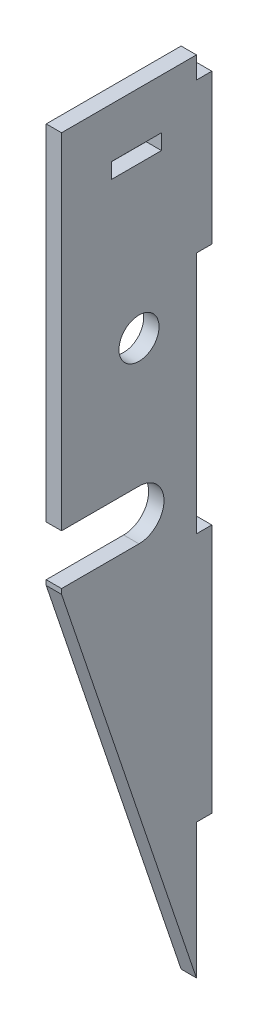
ISO-10303-21;
HEADER;
FILE_DESCRIPTION(('STEP AP214'),'2;1');
FILE_NAME('part.step','',(''),(''),'','','');
FILE_SCHEMA(('AUTOMOTIVE_DESIGN { 1 0 10303 214 1 1 1 1 }'));
ENDSEC;
DATA;
#1=APPLICATION_CONTEXT('core data for automotive mechanical design processes');
#2=APPLICATION_PROTOCOL_DEFINITION('international standard','automotive_design',2000,#1);
#3=PRODUCT_CONTEXT('',#1,'mechanical');
#4=PRODUCT('Part','Part','',(#3));
#5=PRODUCT_RELATED_PRODUCT_CATEGORY('part','',(#4));
#6=PRODUCT_DEFINITION_FORMATION('','',#4);
#7=PRODUCT_DEFINITION_CONTEXT('part definition',#1,'design');
#8=PRODUCT_DEFINITION('design','',#6,#7);
#9=PRODUCT_DEFINITION_SHAPE('','',#8);
#10=(LENGTH_UNIT() NAMED_UNIT(*) SI_UNIT(.MILLI.,.METRE.));
#11=(NAMED_UNIT(*) PLANE_ANGLE_UNIT() SI_UNIT($,.RADIAN.));
#12=(NAMED_UNIT(*) SI_UNIT($,.STERADIAN.) SOLID_ANGLE_UNIT());
#13=UNCERTAINTY_MEASURE_WITH_UNIT(LENGTH_MEASURE(1.E-05),#10,'distance_accuracy_value','');
#14=(GEOMETRIC_REPRESENTATION_CONTEXT(3) GLOBAL_UNCERTAINTY_ASSIGNED_CONTEXT((#13)) GLOBAL_UNIT_ASSIGNED_CONTEXT((#10,
#11,#12)) REPRESENTATION_CONTEXT('',''));
#15=CARTESIAN_POINT('',(0.,0.,0.));
#16=DIRECTION('',(0.,0.,1.));
#17=DIRECTION('',(1.,0.,0.));
#18=AXIS2_PLACEMENT_3D('',#15,#16,#17);
#19=CARTESIAN_POINT('',(-32.09,71.6557513110646,-4.07));
#20=DIRECTION('',(0.,0.,1.));
#21=DIRECTION('',(1.,0.,0.));
#22=AXIS2_PLACEMENT_3D('',#19,#20,#21);
#23=PLANE('',#22);
#24=DIRECTION('',(0.,-1.,0.));
#25=VECTOR('',#24,1.);
#26=CARTESIAN_POINT('',(-29.02,71.6557513110646,-4.07));
#27=LINE('',#26,#25);
#28=CARTESIAN_POINT('',(-29.02,101.635751311065,-4.07));
#29=VERTEX_POINT('',#28);
#30=CARTESIAN_POINT('',(-29.02,71.6557513110646,-4.07));
#31=VERTEX_POINT('',#30);
#32=EDGE_CURVE('E205',#29,#31,#27,.T.);
#33=ORIENTED_EDGE('',*,*,#32,.T.);
#34=DIRECTION('',(1.,0.,0.));
#35=VECTOR('',#34,1.);
#36=CARTESIAN_POINT('',(-32.09,71.6557513110646,-4.07));
#37=LINE('',#36,#35);
#38=CARTESIAN_POINT('',(-32.09,71.6557513110646,-4.07));
#39=VERTEX_POINT('',#38);
#40=EDGE_CURVE('E316',#39,#31,#37,.T.);
#41=ORIENTED_EDGE('',*,*,#40,.F.);
#42=DIRECTION('',(0.,-1.,0.));
#43=VECTOR('',#42,1.);
#44=CARTESIAN_POINT('',(-32.09,71.6557513110646,-4.07));
#45=LINE('',#44,#43);
#46=CARTESIAN_POINT('',(-32.09,101.635751311065,-4.07));
#47=VERTEX_POINT('',#46);
#48=EDGE_CURVE('E206',#47,#39,#45,.T.);
#49=ORIENTED_EDGE('',*,*,#48,.F.);
#50=DIRECTION('',(1.,0.,0.));
#51=VECTOR('',#50,1.);
#52=CARTESIAN_POINT('',(-32.09,101.635751311065,-4.07));
#53=LINE('',#52,#51);
#54=EDGE_CURVE('E240',#47,#29,#53,.T.);
#55=ORIENTED_EDGE('',*,*,#54,.T.);
#56=EDGE_LOOP('',(#33,#41,#49,#55));
#57=FACE_BOUND('',#56,.T.);
#58=ADVANCED_FACE('F43',(#57),#23,.F.);
#59=CARTESIAN_POINT('',(-32.09,71.6557513110646,-1.));
#60=DIRECTION('',(0.,1.,0.));
#61=DIRECTION('',(-1.,0.,0.));
#62=AXIS2_PLACEMENT_3D('',#59,#60,#61);
#63=PLANE('',#62);
#64=DIRECTION('',(0.,0.,1.));
#65=VECTOR('',#64,1.);
#66=CARTESIAN_POINT('',(-29.02,71.6557513110646,-1.));
#67=LINE('',#66,#65);
#68=CARTESIAN_POINT('',(-29.02,71.6557513110646,-1.));
#69=VERTEX_POINT('',#68);
#70=EDGE_CURVE('E243',#31,#69,#67,.T.);
#71=ORIENTED_EDGE('',*,*,#70,.T.);
#72=DIRECTION('',(1.,0.,0.));
#73=VECTOR('',#72,1.);
#74=CARTESIAN_POINT('',(-32.09,71.6557513110646,-1.));
#75=LINE('',#74,#73);
#76=CARTESIAN_POINT('',(-32.09,71.6557513110646,-1.));
#77=VERTEX_POINT('',#76);
#78=EDGE_CURVE('E313',#77,#69,#75,.T.);
#79=ORIENTED_EDGE('',*,*,#78,.F.);
#80=DIRECTION('',(0.,0.,1.));
#81=VECTOR('',#80,1.);
#82=CARTESIAN_POINT('',(-32.09,71.6557513110646,-1.));
#83=LINE('',#82,#81);
#84=EDGE_CURVE('E209',#39,#77,#83,.T.);
#85=ORIENTED_EDGE('',*,*,#84,.F.);
#86=ORIENTED_EDGE('',*,*,#40,.T.);
#87=EDGE_LOOP('',(#71,#79,#85,#86));
#88=FACE_BOUND('',#87,.T.);
#89=ADVANCED_FACE('F347',(#88),#63,.F.);
#90=CARTESIAN_POINT('',(-32.09,22.99,-1.));
#91=DIRECTION('',(0.,0.,1.));
#92=DIRECTION('',(1.,0.,0.));
#93=AXIS2_PLACEMENT_3D('',#90,#91,#92);
#94=PLANE('',#93);
#95=DIRECTION('',(0.,-1.,0.));
#96=VECTOR('',#95,1.);
#97=CARTESIAN_POINT('',(-29.02,22.99,-1.));
#98=LINE('',#97,#96);
#99=CARTESIAN_POINT('',(-29.02,22.99,-1.));
#100=VERTEX_POINT('',#99);
#101=EDGE_CURVE('E245',#69,#100,#98,.T.);
#102=ORIENTED_EDGE('',*,*,#101,.T.);
#103=DIRECTION('',(1.,0.,0.));
#104=VECTOR('',#103,1.);
#105=CARTESIAN_POINT('',(-32.09,22.99,-1.));
#106=LINE('',#105,#104);
#107=CARTESIAN_POINT('',(-32.09,22.99,-1.));
#108=VERTEX_POINT('',#107);
#109=EDGE_CURVE('E310',#108,#100,#106,.T.);
#110=ORIENTED_EDGE('',*,*,#109,.F.);
#111=DIRECTION('',(0.,-1.,0.));
#112=VECTOR('',#111,1.);
#113=CARTESIAN_POINT('',(-32.09,22.99,-1.));
#114=LINE('',#113,#112);
#115=EDGE_CURVE('E212',#77,#108,#114,.T.);
#116=ORIENTED_EDGE('',*,*,#115,.F.);
#117=ORIENTED_EDGE('',*,*,#78,.T.);
#118=EDGE_LOOP('',(#102,#110,#116,#117));
#119=FACE_BOUND('',#118,.T.);
#120=ADVANCED_FACE('F353',(#119),#94,.F.);
#121=CARTESIAN_POINT('',(-32.09,22.99,-4.07));
#122=DIRECTION('',(0.,-1.,0.));
#123=DIRECTION('',(0.,0.,-1.));
#124=AXIS2_PLACEMENT_3D('',#121,#122,#123);
#125=PLANE('',#124);
#126=DIRECTION('',(0.,0.,-1.));
#127=VECTOR('',#126,1.);
#128=CARTESIAN_POINT('',(-29.02,22.99,-4.07));
#129=LINE('',#128,#127);
#130=CARTESIAN_POINT('',(-29.02,22.99,-4.07));
#131=VERTEX_POINT('',#130);
#132=EDGE_CURVE('E247',#100,#131,#129,.T.);
#133=ORIENTED_EDGE('',*,*,#132,.T.);
#134=DIRECTION('',(1.,0.,0.));
#135=VECTOR('',#134,1.);
#136=CARTESIAN_POINT('',(-32.09,22.99,-4.07));
#137=LINE('',#136,#135);
#138=CARTESIAN_POINT('',(-32.09,22.99,-4.07));
#139=VERTEX_POINT('',#138);
#140=EDGE_CURVE('E307',#139,#131,#137,.T.);
#141=ORIENTED_EDGE('',*,*,#140,.F.);
#142=DIRECTION('',(0.,0.,-1.));
#143=VECTOR('',#142,1.);
#144=CARTESIAN_POINT('',(-32.09,22.99,-4.07));
#145=LINE('',#144,#143);
#146=EDGE_CURVE('E214',#108,#139,#145,.T.);
#147=ORIENTED_EDGE('',*,*,#146,.F.);
#148=ORIENTED_EDGE('',*,*,#109,.T.);
#149=EDGE_LOOP('',(#133,#141,#147,#148));
#150=FACE_BOUND('',#149,.T.);
#151=ADVANCED_FACE('F427',(#150),#125,.F.);
#152=CARTESIAN_POINT('',(-32.09,-26.99,-4.07));
#153=DIRECTION('',(0.,0.,1.));
#154=DIRECTION('',(1.,0.,0.));
#155=AXIS2_PLACEMENT_3D('',#152,#153,#154);
#156=PLANE('',#155);
#157=DIRECTION('',(0.,-1.,0.));
#158=VECTOR('',#157,1.);
#159=CARTESIAN_POINT('',(-29.02,-26.99,-4.07));
#160=LINE('',#159,#158);
#161=CARTESIAN_POINT('',(-29.02,-26.99,-4.07));
#162=VERTEX_POINT('',#161);
#163=EDGE_CURVE('E249',#131,#162,#160,.T.);
#164=ORIENTED_EDGE('',*,*,#163,.T.);
#165=DIRECTION('',(1.,0.,0.));
#166=VECTOR('',#165,1.);
#167=CARTESIAN_POINT('',(-32.09,-26.99,-4.07));
#168=LINE('',#167,#166);
#169=CARTESIAN_POINT('',(-32.09,-26.99,-4.07));
#170=VERTEX_POINT('',#169);
#171=EDGE_CURVE('E304',#170,#162,#168,.T.);
#172=ORIENTED_EDGE('',*,*,#171,.F.);
#173=DIRECTION('',(0.,-1.,0.));
#174=VECTOR('',#173,1.);
#175=CARTESIAN_POINT('',(-32.09,-26.99,-4.07));
#176=LINE('',#175,#174);
#177=EDGE_CURVE('E216',#139,#170,#176,.T.);
#178=ORIENTED_EDGE('',*,*,#177,.F.);
#179=ORIENTED_EDGE('',*,*,#140,.T.);
#180=EDGE_LOOP('',(#164,#172,#178,#179));
#181=FACE_BOUND('',#180,.T.);
#182=ADVANCED_FACE('F422',(#181),#156,.F.);
#183=CARTESIAN_POINT('',(-32.09,-26.99,-1.));
#184=DIRECTION('',(0.,1.,0.));
#185=DIRECTION('',(-1.,0.,0.));
#186=AXIS2_PLACEMENT_3D('',#183,#184,#185);
#187=PLANE('',#186);
#188=DIRECTION('',(0.,0.,1.));
#189=VECTOR('',#188,1.);
#190=CARTESIAN_POINT('',(-29.02,-26.99,-1.));
#191=LINE('',#190,#189);
#192=CARTESIAN_POINT('',(-29.02,-26.99,-1.));
#193=VERTEX_POINT('',#192);
#194=EDGE_CURVE('E251',#162,#193,#191,.T.);
#195=ORIENTED_EDGE('',*,*,#194,.T.);
#196=DIRECTION('',(1.,0.,0.));
#197=VECTOR('',#196,1.);
#198=CARTESIAN_POINT('',(-32.09,-26.99,-1.));
#199=LINE('',#198,#197);
#200=CARTESIAN_POINT('',(-32.09,-26.99,-1.));
#201=VERTEX_POINT('',#200);
#202=EDGE_CURVE('E301',#201,#193,#199,.T.);
#203=ORIENTED_EDGE('',*,*,#202,.F.);
#204=DIRECTION('',(0.,0.,1.));
#205=VECTOR('',#204,1.);
#206=CARTESIAN_POINT('',(-32.09,-26.99,-1.));
#207=LINE('',#206,#205);
#208=EDGE_CURVE('E218',#170,#201,#207,.T.);
#209=ORIENTED_EDGE('',*,*,#208,.F.);
#210=ORIENTED_EDGE('',*,*,#171,.T.);
#211=EDGE_LOOP('',(#195,#203,#209,#210));
#212=FACE_BOUND('',#211,.T.);
#213=ADVANCED_FACE('F418',(#212),#187,.F.);
#214=CARTESIAN_POINT('',(-32.09,-54.,-1.));
#215=DIRECTION('',(0.,0.,1.));
#216=DIRECTION('',(1.,0.,0.));
#217=AXIS2_PLACEMENT_3D('',#214,#215,#216);
#218=PLANE('',#217);
#219=DIRECTION('',(0.,-1.,0.));
#220=VECTOR('',#219,1.);
#221=CARTESIAN_POINT('',(-29.02,-54.,-1.));
#222=LINE('',#221,#220);
#223=CARTESIAN_POINT('',(-29.02,-54.,-1.));
#224=VERTEX_POINT('',#223);
#225=EDGE_CURVE('E253',#193,#224,#222,.T.);
#226=ORIENTED_EDGE('',*,*,#225,.T.);
#227=DIRECTION('',(1.,0.,0.));
#228=VECTOR('',#227,1.);
#229=CARTESIAN_POINT('',(-32.09,-54.,-1.));
#230=LINE('',#229,#228);
#231=CARTESIAN_POINT('',(-32.09,-54.,-1.));
#232=VERTEX_POINT('',#231);
#233=EDGE_CURVE('E298',#232,#224,#230,.T.);
#234=ORIENTED_EDGE('',*,*,#233,.F.);
#235=DIRECTION('',(0.,-1.,0.));
#236=VECTOR('',#235,1.);
#237=CARTESIAN_POINT('',(-32.09,-54.,-1.));
#238=LINE('',#237,#236);
#239=EDGE_CURVE('E220',#201,#232,#238,.T.);
#240=ORIENTED_EDGE('',*,*,#239,.F.);
#241=ORIENTED_EDGE('',*,*,#202,.T.);
#242=EDGE_LOOP('',(#226,#234,#240,#241));
#243=FACE_BOUND('',#242,.T.);
#244=ADVANCED_FACE('F414',(#243),#218,.F.);
#245=CARTESIAN_POINT('',(-32.09,26.,26.));
#246=DIRECTION('',(0.,0.31977864415818,-0.947492278987199));
#247=DIRECTION('',(0.,0.947492278987199,0.31977864415818));
#248=AXIS2_PLACEMENT_3D('',#245,#246,#247);
#249=PLANE('',#248);
#250=DIRECTION('',(0.,0.947492278987199,0.31977864415818));
#251=VECTOR('',#250,1.);
#252=CARTESIAN_POINT('',(-29.02,26.,26.));
#253=LINE('',#252,#251);
#254=CARTESIAN_POINT('',(-29.02,26.,26.));
#255=VERTEX_POINT('',#254);
#256=EDGE_CURVE('E255',#224,#255,#253,.T.);
#257=ORIENTED_EDGE('',*,*,#256,.T.);
#258=DIRECTION('',(1.,0.,0.));
#259=VECTOR('',#258,1.);
#260=CARTESIAN_POINT('',(-32.09,26.,26.));
#261=LINE('',#260,#259);
#262=CARTESIAN_POINT('',(-32.09,26.,26.));
#263=VERTEX_POINT('',#262);
#264=EDGE_CURVE('E295',#263,#255,#261,.T.);
#265=ORIENTED_EDGE('',*,*,#264,.F.);
#266=DIRECTION('',(0.,0.947492278987199,0.31977864415818));
#267=VECTOR('',#266,1.);
#268=CARTESIAN_POINT('',(-32.09,26.,26.));
#269=LINE('',#268,#267);
#270=EDGE_CURVE('E222',#232,#263,#269,.T.);
#271=ORIENTED_EDGE('',*,*,#270,.F.);
#272=ORIENTED_EDGE('',*,*,#233,.T.);
#273=EDGE_LOOP('',(#257,#265,#271,#272));
#274=FACE_BOUND('',#273,.T.);
#275=ADVANCED_FACE('F409',(#274),#249,.F.);
#276=CARTESIAN_POINT('',(-32.09,27.,26.));
#277=DIRECTION('',(0.,0.,-1.));
#278=DIRECTION('',(-1.,0.,0.));
#279=AXIS2_PLACEMENT_3D('',#276,#277,#278);
#280=PLANE('',#279);
#281=DIRECTION('',(0.,1.,0.));
#282=VECTOR('',#281,1.);
#283=CARTESIAN_POINT('',(-29.02,27.,26.));
#284=LINE('',#283,#282);
#285=CARTESIAN_POINT('',(-29.02,27.,26.));
#286=VERTEX_POINT('',#285);
#287=EDGE_CURVE('E257',#255,#286,#284,.T.);
#288=ORIENTED_EDGE('',*,*,#287,.T.);
#289=DIRECTION('',(1.,0.,0.));
#290=VECTOR('',#289,1.);
#291=CARTESIAN_POINT('',(-32.09,27.,26.));
#292=LINE('',#291,#290);
#293=CARTESIAN_POINT('',(-32.09,27.,26.));
#294=VERTEX_POINT('',#293);
#295=EDGE_CURVE('E292',#294,#286,#292,.T.);
#296=ORIENTED_EDGE('',*,*,#295,.F.);
#297=DIRECTION('',(0.,1.,0.));
#298=VECTOR('',#297,1.);
#299=CARTESIAN_POINT('',(-32.09,27.,26.));
#300=LINE('',#299,#298);
#301=EDGE_CURVE('E224',#263,#294,#300,.T.);
#302=ORIENTED_EDGE('',*,*,#301,.F.);
#303=ORIENTED_EDGE('',*,*,#264,.T.);
#304=EDGE_LOOP('',(#288,#296,#302,#303));
#305=FACE_BOUND('',#304,.T.);
#306=ADVANCED_FACE('F403',(#305),#280,.F.);
#307=CARTESIAN_POINT('',(-32.09,27.,26.));
#308=DIRECTION('',(0.,-1.,0.));
#309=DIRECTION('',(1.,0.,0.));
#310=AXIS2_PLACEMENT_3D('',#307,#308,#309);
#311=PLANE('',#310);
#312=DIRECTION('',(0.,0.,-1.));
#313=VECTOR('',#312,1.);
#314=CARTESIAN_POINT('',(-29.02,27.,26.));
#315=LINE('',#314,#313);
#316=CARTESIAN_POINT('',(-29.02,27.,10.5));
#317=VERTEX_POINT('',#316);
#318=EDGE_CURVE('E259',#286,#317,#315,.T.);
#319=ORIENTED_EDGE('',*,*,#318,.T.);
#320=DIRECTION('',(1.,0.,0.));
#321=VECTOR('',#320,1.);
#322=CARTESIAN_POINT('',(-32.09,27.,10.5));
#323=LINE('',#322,#321);
#324=CARTESIAN_POINT('',(-32.09,27.,10.5));
#325=VERTEX_POINT('',#324);
#326=EDGE_CURVE('E289',#325,#317,#323,.T.);
#327=ORIENTED_EDGE('',*,*,#326,.F.);
#328=DIRECTION('',(0.,0.,-1.));
#329=VECTOR('',#328,1.);
#330=CARTESIAN_POINT('',(-32.09,27.,26.));
#331=LINE('',#330,#329);
#332=EDGE_CURVE('E226',#294,#325,#331,.T.);
#333=ORIENTED_EDGE('',*,*,#332,.F.);
#334=ORIENTED_EDGE('',*,*,#295,.T.);
#335=EDGE_LOOP('',(#319,#327,#333,#334));
#336=FACE_BOUND('',#335,.T.);
#337=ADVANCED_FACE('F399',(#336),#311,.F.);
#338=CARTESIAN_POINT('',(-32.09,32.,10.5));
#339=DIRECTION('',(1.,0.,0.));
#340=DIRECTION('',(0.,1.,0.));
#341=AXIS2_PLACEMENT_3D('',#338,#339,#340);
#342=CYLINDRICAL_SURFACE('',#341,5.00000000000001);
#343=CARTESIAN_POINT('',(-29.02,32.,10.5));
#344=DIRECTION('',(1.,0.,0.));
#345=DIRECTION('',(0.,-1.,0.));
#346=AXIS2_PLACEMENT_3D('',#343,#344,#345);
#347=CIRCLE('',#346,5.00000000000001);
#348=CARTESIAN_POINT('',(-29.02,37.,10.5));
#349=VERTEX_POINT('',#348);
#350=EDGE_CURVE('E261',#317,#349,#347,.T.);
#351=ORIENTED_EDGE('',*,*,#350,.T.);
#352=DIRECTION('',(1.,0.,0.));
#353=VECTOR('',#352,1.);
#354=CARTESIAN_POINT('',(-32.09,37.,10.5));
#355=LINE('',#354,#353);
#356=CARTESIAN_POINT('',(-32.09,37.,10.5));
#357=VERTEX_POINT('',#356);
#358=EDGE_CURVE('E286',#357,#349,#355,.T.);
#359=ORIENTED_EDGE('',*,*,#358,.F.);
#360=CARTESIAN_POINT('',(-32.09,32.,10.5));
#361=DIRECTION('',(1.,0.,0.));
#362=DIRECTION('',(0.,-1.,0.));
#363=AXIS2_PLACEMENT_3D('',#360,#361,#362);
#364=CIRCLE('',#363,5.00000000000001);
#365=EDGE_CURVE('E228',#325,#357,#364,.T.);
#366=ORIENTED_EDGE('',*,*,#365,.F.);
#367=ORIENTED_EDGE('',*,*,#326,.T.);
#368=EDGE_LOOP('',(#351,#359,#366,#367));
#369=FACE_BOUND('',#368,.T.);
#370=ADVANCED_FACE('F394',(#369),#342,.F.);
#371=CARTESIAN_POINT('',(-32.09,37.,26.));
#372=DIRECTION('',(0.,1.,0.));
#373=DIRECTION('',(-1.,0.,0.));
#374=AXIS2_PLACEMENT_3D('',#371,#372,#373);
#375=PLANE('',#374);
#376=DIRECTION('',(0.,0.,1.));
#377=VECTOR('',#376,1.);
#378=CARTESIAN_POINT('',(-29.02,37.,26.));
#379=LINE('',#378,#377);
#380=CARTESIAN_POINT('',(-29.02,37.,26.));
#381=VERTEX_POINT('',#380);
#382=EDGE_CURVE('E263',#349,#381,#379,.T.);
#383=ORIENTED_EDGE('',*,*,#382,.T.);
#384=DIRECTION('',(1.,0.,0.));
#385=VECTOR('',#384,1.);
#386=CARTESIAN_POINT('',(-32.09,37.,26.));
#387=LINE('',#386,#385);
#388=CARTESIAN_POINT('',(-32.09,37.,26.));
#389=VERTEX_POINT('',#388);
#390=EDGE_CURVE('E283',#389,#381,#387,.T.);
#391=ORIENTED_EDGE('',*,*,#390,.F.);
#392=DIRECTION('',(0.,0.,1.));
#393=VECTOR('',#392,1.);
#394=CARTESIAN_POINT('',(-32.09,37.,26.));
#395=LINE('',#394,#393);
#396=EDGE_CURVE('E230',#357,#389,#395,.T.);
#397=ORIENTED_EDGE('',*,*,#396,.F.);
#398=ORIENTED_EDGE('',*,*,#358,.T.);
#399=EDGE_LOOP('',(#383,#391,#397,#398));
#400=FACE_BOUND('',#399,.T.);
#401=ADVANCED_FACE('F388',(#400),#375,.F.);
#402=CARTESIAN_POINT('',(-32.09,106.,26.));
#403=DIRECTION('',(0.,0.,-1.));
#404=DIRECTION('',(0.,1.,0.));
#405=AXIS2_PLACEMENT_3D('',#402,#403,#404);
#406=PLANE('',#405);
#407=DIRECTION('',(0.,1.,0.));
#408=VECTOR('',#407,1.);
#409=CARTESIAN_POINT('',(-29.02,106.,26.));
#410=LINE('',#409,#408);
#411=CARTESIAN_POINT('',(-29.02,106.,26.));
#412=VERTEX_POINT('',#411);
#413=EDGE_CURVE('E265',#381,#412,#410,.T.);
#414=ORIENTED_EDGE('',*,*,#413,.T.);
#415=DIRECTION('',(1.,0.,0.));
#416=VECTOR('',#415,1.);
#417=CARTESIAN_POINT('',(-32.09,106.,26.));
#418=LINE('',#417,#416);
#419=CARTESIAN_POINT('',(-32.09,106.,26.));
#420=VERTEX_POINT('',#419);
#421=EDGE_CURVE('E280',#420,#412,#418,.T.);
#422=ORIENTED_EDGE('',*,*,#421,.F.);
#423=DIRECTION('',(0.,1.,0.));
#424=VECTOR('',#423,1.);
#425=CARTESIAN_POINT('',(-32.09,106.,26.));
#426=LINE('',#425,#424);
#427=EDGE_CURVE('E232',#389,#420,#426,.T.);
#428=ORIENTED_EDGE('',*,*,#427,.F.);
#429=ORIENTED_EDGE('',*,*,#390,.T.);
#430=EDGE_LOOP('',(#414,#422,#428,#429));
#431=FACE_BOUND('',#430,.T.);
#432=ADVANCED_FACE('F384',(#431),#406,.F.);
#433=CARTESIAN_POINT('',(-32.09,106.,-1.));
#434=DIRECTION('',(0.,-1.,0.));
#435=DIRECTION('',(1.,0.,0.));
#436=AXIS2_PLACEMENT_3D('',#433,#434,#435);
#437=PLANE('',#436);
#438=DIRECTION('',(0.,0.,-1.));
#439=VECTOR('',#438,1.);
#440=CARTESIAN_POINT('',(-29.02,106.,-1.));
#441=LINE('',#440,#439);
#442=CARTESIAN_POINT('',(-29.02,106.,-1.));
#443=VERTEX_POINT('',#442);
#444=EDGE_CURVE('E267',#412,#443,#441,.T.);
#445=ORIENTED_EDGE('',*,*,#444,.T.);
#446=DIRECTION('',(1.,0.,0.));
#447=VECTOR('',#446,1.);
#448=CARTESIAN_POINT('',(-32.09,106.,-1.));
#449=LINE('',#448,#447);
#450=CARTESIAN_POINT('',(-32.09,106.,-1.));
#451=VERTEX_POINT('',#450);
#452=EDGE_CURVE('E277',#451,#443,#449,.T.);
#453=ORIENTED_EDGE('',*,*,#452,.F.);
#454=DIRECTION('',(0.,0.,-1.));
#455=VECTOR('',#454,1.);
#456=CARTESIAN_POINT('',(-32.09,106.,-1.));
#457=LINE('',#456,#455);
#458=EDGE_CURVE('E234',#420,#451,#457,.T.);
#459=ORIENTED_EDGE('',*,*,#458,.F.);
#460=ORIENTED_EDGE('',*,*,#421,.T.);
#461=EDGE_LOOP('',(#445,#453,#459,#460));
#462=FACE_BOUND('',#461,.T.);
#463=ADVANCED_FACE('F379',(#462),#437,.F.);
#464=CARTESIAN_POINT('',(-32.09,101.635751311065,-1.));
#465=DIRECTION('',(0.,0.,1.));
#466=DIRECTION('',(1.,0.,0.));
#467=AXIS2_PLACEMENT_3D('',#464,#465,#466);
#468=PLANE('',#467);
#469=DIRECTION('',(0.,-1.,0.));
#470=VECTOR('',#469,1.);
#471=CARTESIAN_POINT('',(-29.02,101.635751311065,-1.));
#472=LINE('',#471,#470);
#473=CARTESIAN_POINT('',(-29.02,101.635751311065,-1.));
#474=VERTEX_POINT('',#473);
#475=EDGE_CURVE('E269',#443,#474,#472,.T.);
#476=ORIENTED_EDGE('',*,*,#475,.T.);
#477=DIRECTION('',(1.,0.,0.));
#478=VECTOR('',#477,1.);
#479=CARTESIAN_POINT('',(-32.09,101.635751311065,-1.));
#480=LINE('',#479,#478);
#481=CARTESIAN_POINT('',(-32.09,101.635751311065,-1.));
#482=VERTEX_POINT('',#481);
#483=EDGE_CURVE('E274',#482,#474,#480,.T.);
#484=ORIENTED_EDGE('',*,*,#483,.F.);
#485=DIRECTION('',(0.,-1.,0.));
#486=VECTOR('',#485,1.);
#487=CARTESIAN_POINT('',(-32.09,101.635751311065,-1.));
#488=LINE('',#487,#486);
#489=EDGE_CURVE('E236',#451,#482,#488,.T.);
#490=ORIENTED_EDGE('',*,*,#489,.F.);
#491=ORIENTED_EDGE('',*,*,#452,.T.);
#492=EDGE_LOOP('',(#476,#484,#490,#491));
#493=FACE_BOUND('',#492,.T.);
#494=ADVANCED_FACE('F373',(#493),#468,.F.);
#495=CARTESIAN_POINT('',(-32.09,101.635751311065,-4.07));
#496=DIRECTION('',(0.,-1.,0.));
#497=DIRECTION('',(1.,0.,0.));
#498=AXIS2_PLACEMENT_3D('',#495,#496,#497);
#499=PLANE('',#498);
#500=DIRECTION('',(0.,0.,-1.));
#501=VECTOR('',#500,1.);
#502=CARTESIAN_POINT('',(-29.02,101.635751311065,-4.07));
#503=LINE('',#502,#501);
#504=EDGE_CURVE('E210',#474,#29,#503,.T.);
#505=ORIENTED_EDGE('',*,*,#504,.T.);
#506=ORIENTED_EDGE('',*,*,#54,.F.);
#507=DIRECTION('',(0.,0.,-1.));
#508=VECTOR('',#507,1.);
#509=CARTESIAN_POINT('',(-32.09,101.635751311065,-4.07));
#510=LINE('',#509,#508);
#511=EDGE_CURVE('E238',#482,#47,#510,.T.);
#512=ORIENTED_EDGE('',*,*,#511,.F.);
#513=ORIENTED_EDGE('',*,*,#483,.T.);
#514=EDGE_LOOP('',(#505,#506,#512,#513));
#515=FACE_BOUND('',#514,.T.);
#516=ADVANCED_FACE('F371',(#515),#499,.F.);
#517=CARTESIAN_POINT('',(-32.09,32.,10.5));
#518=DIRECTION('',(-1.,0.,0.));
#519=DIRECTION('',(0.,-1.,0.));
#520=AXIS2_PLACEMENT_3D('',#517,#518,#519);
#521=PLANE('',#520);
#522=DIRECTION('',(0.,1.,0.));
#523=VECTOR('',#522,1.);
#524=CARTESIAN_POINT('',(-32.09,32.,16.));
#525=LINE('',#524,#523);
#526=CARTESIAN_POINT('',(-32.09,92.91,16.));
#527=VERTEX_POINT('',#526);
#528=CARTESIAN_POINT('',(-32.09,96.,16.));
#529=VERTEX_POINT('',#528);
#530=EDGE_CURVE('E187',#527,#529,#525,.T.);
#531=ORIENTED_EDGE('',*,*,#530,.F.);
#532=DIRECTION('',(0.,0.,1.));
#533=VECTOR('',#532,1.);
#534=CARTESIAN_POINT('',(-32.09,92.91,10.5));
#535=LINE('',#534,#533);
#536=CARTESIAN_POINT('',(-32.09,92.91,6.));
#537=VERTEX_POINT('',#536);
#538=EDGE_CURVE('E176',#537,#527,#535,.T.);
#539=ORIENTED_EDGE('',*,*,#538,.F.);
#540=DIRECTION('',(0.,-1.,0.));
#541=VECTOR('',#540,1.);
#542=CARTESIAN_POINT('',(-32.09,32.,6.));
#543=LINE('',#542,#541);
#544=CARTESIAN_POINT('',(-32.09,96.,6.));
#545=VERTEX_POINT('',#544);
#546=EDGE_CURVE('E181',#545,#537,#543,.T.);
#547=ORIENTED_EDGE('',*,*,#546,.F.);
#548=DIRECTION('',(0.,0.,-1.));
#549=VECTOR('',#548,1.);
#550=CARTESIAN_POINT('',(-32.09,96.,10.5));
#551=LINE('',#550,#549);
#552=EDGE_CURVE('E194',#529,#545,#551,.T.);
#553=ORIENTED_EDGE('',*,*,#552,.F.);
#554=EDGE_LOOP('',(#531,#539,#547,#553));
#555=FACE_BOUND('',#554,.T.);
#556=CARTESIAN_POINT('',(-32.09,62.6457513110646,10.5));
#557=DIRECTION('',(-1.,0.,0.));
#558=DIRECTION('',(0.,-1.,0.));
#559=AXIS2_PLACEMENT_3D('',#556,#557,#558);
#560=CIRCLE('',#559,4.01);
#561=CARTESIAN_POINT('',(-32.09,58.6357513110646,10.5));
#562=VERTEX_POINT('',#561);
#563=EDGE_CURVE('E198',#562,#562,#560,.T.);
#564=ORIENTED_EDGE('',*,*,#563,.F.);
#565=EDGE_LOOP('',(#564));
#566=FACE_BOUND('',#565,.T.);
#567=ORIENTED_EDGE('',*,*,#48,.T.);
#568=ORIENTED_EDGE('',*,*,#84,.T.);
#569=ORIENTED_EDGE('',*,*,#115,.T.);
#570=ORIENTED_EDGE('',*,*,#146,.T.);
#571=ORIENTED_EDGE('',*,*,#177,.T.);
#572=ORIENTED_EDGE('',*,*,#208,.T.);
#573=ORIENTED_EDGE('',*,*,#239,.T.);
#574=ORIENTED_EDGE('',*,*,#270,.T.);
#575=ORIENTED_EDGE('',*,*,#301,.T.);
#576=ORIENTED_EDGE('',*,*,#332,.T.);
#577=ORIENTED_EDGE('',*,*,#365,.T.);
#578=ORIENTED_EDGE('',*,*,#396,.T.);
#579=ORIENTED_EDGE('',*,*,#427,.T.);
#580=ORIENTED_EDGE('',*,*,#458,.T.);
#581=ORIENTED_EDGE('',*,*,#489,.T.);
#582=ORIENTED_EDGE('',*,*,#511,.T.);
#583=EDGE_LOOP('',(#567,#568,#569,#570,#571,#572,#573,#574,#575,#576,#577,#578,#579,#580,#581,#582));
#584=FACE_BOUND('',#583,.T.);
#585=ADVANCED_FACE('F192',(#555,#566,#584),#521,.T.);
#586=CARTESIAN_POINT('',(-29.02,32.,10.5));
#587=DIRECTION('',(-1.,0.,0.));
#588=DIRECTION('',(0.,-1.,0.));
#589=AXIS2_PLACEMENT_3D('',#586,#587,#588);
#590=PLANE('',#589);
#591=DIRECTION('',(0.,0.,1.));
#592=VECTOR('',#591,1.);
#593=CARTESIAN_POINT('',(-29.02,92.91,10.5));
#594=LINE('',#593,#592);
#595=CARTESIAN_POINT('',(-29.02,92.91,6.));
#596=VERTEX_POINT('',#595);
#597=CARTESIAN_POINT('',(-29.02,92.91,16.));
#598=VERTEX_POINT('',#597);
#599=EDGE_CURVE('E319',#596,#598,#594,.T.);
#600=ORIENTED_EDGE('',*,*,#599,.T.);
#601=DIRECTION('',(0.,1.,0.));
#602=VECTOR('',#601,1.);
#603=CARTESIAN_POINT('',(-29.02,32.,16.));
#604=LINE('',#603,#602);
#605=CARTESIAN_POINT('',(-29.02,96.,16.));
#606=VERTEX_POINT('',#605);
#607=EDGE_CURVE('E11',#598,#606,#604,.T.);
#608=ORIENTED_EDGE('',*,*,#607,.T.);
#609=DIRECTION('',(0.,0.,-1.));
#610=VECTOR('',#609,1.);
#611=CARTESIAN_POINT('',(-29.02,96.,10.5));
#612=LINE('',#611,#610);
#613=CARTESIAN_POINT('',(-29.02,96.,6.));
#614=VERTEX_POINT('',#613);
#615=EDGE_CURVE('E50',#606,#614,#612,.T.);
#616=ORIENTED_EDGE('',*,*,#615,.T.);
#617=DIRECTION('',(0.,-1.,0.));
#618=VECTOR('',#617,1.);
#619=CARTESIAN_POINT('',(-29.02,32.,6.));
#620=LINE('',#619,#618);
#621=EDGE_CURVE('E321',#614,#596,#620,.T.);
#622=ORIENTED_EDGE('',*,*,#621,.T.);
#623=EDGE_LOOP('',(#600,#608,#616,#622));
#624=FACE_BOUND('',#623,.T.);
#625=CARTESIAN_POINT('',(-29.02,62.6457513110646,10.5));
#626=DIRECTION('',(1.,0.,0.));
#627=DIRECTION('',(0.,1.,0.));
#628=AXIS2_PLACEMENT_3D('',#625,#626,#627);
#629=CIRCLE('',#628,4.01);
#630=CARTESIAN_POINT('',(-29.02,66.6557513110646,10.5));
#631=VERTEX_POINT('',#630);
#632=EDGE_CURVE('E195',#631,#631,#629,.T.);
#633=ORIENTED_EDGE('',*,*,#632,.F.);
#634=EDGE_LOOP('',(#633));
#635=FACE_BOUND('',#634,.T.);
#636=ORIENTED_EDGE('',*,*,#32,.F.);
#637=ORIENTED_EDGE('',*,*,#504,.F.);
#638=ORIENTED_EDGE('',*,*,#475,.F.);
#639=ORIENTED_EDGE('',*,*,#444,.F.);
#640=ORIENTED_EDGE('',*,*,#413,.F.);
#641=ORIENTED_EDGE('',*,*,#382,.F.);
#642=ORIENTED_EDGE('',*,*,#350,.F.);
#643=ORIENTED_EDGE('',*,*,#318,.F.);
#644=ORIENTED_EDGE('',*,*,#287,.F.);
#645=ORIENTED_EDGE('',*,*,#256,.F.);
#646=ORIENTED_EDGE('',*,*,#225,.F.);
#647=ORIENTED_EDGE('',*,*,#194,.F.);
#648=ORIENTED_EDGE('',*,*,#163,.F.);
#649=ORIENTED_EDGE('',*,*,#132,.F.);
#650=ORIENTED_EDGE('',*,*,#101,.F.);
#651=ORIENTED_EDGE('',*,*,#70,.F.);
#652=EDGE_LOOP('',(#636,#637,#638,#639,#640,#641,#642,#643,#644,#645,#646,#647,#648,#649,#650,#651));
#653=FACE_BOUND('',#652,.T.);
#654=ADVANCED_FACE('F325',(#624,#635,#653),#590,.F.);
#655=CARTESIAN_POINT('',(-75.,62.6457513110646,10.5));
#656=DIRECTION('',(1.,0.,0.));
#657=DIRECTION('',(0.,1.,0.));
#658=AXIS2_PLACEMENT_3D('',#655,#656,#657);
#659=CYLINDRICAL_SURFACE('',#658,4.01);
#660=ORIENTED_EDGE('',*,*,#563,.T.);
#661=EDGE_LOOP('',(#660));
#662=FACE_BOUND('',#661,.T.);
#663=ORIENTED_EDGE('',*,*,#632,.T.);
#664=EDGE_LOOP('',(#663));
#665=FACE_BOUND('',#664,.T.);
#666=ADVANCED_FACE('F464',(#662,#665),#659,.F.);
#667=CARTESIAN_POINT('',(-75.,92.91,16.));
#668=DIRECTION('',(0.,0.,1.));
#669=DIRECTION('',(1.,0.,0.));
#670=AXIS2_PLACEMENT_3D('',#667,#668,#669);
#671=PLANE('',#670);
#672=ORIENTED_EDGE('',*,*,#530,.T.);
#673=DIRECTION('',(1.,0.,0.));
#674=VECTOR('',#673,1.);
#675=CARTESIAN_POINT('',(-75.,96.,16.));
#676=LINE('',#675,#674);
#677=EDGE_CURVE('E182',#529,#606,#676,.T.);
#678=ORIENTED_EDGE('',*,*,#677,.T.);
#679=ORIENTED_EDGE('',*,*,#607,.F.);
#680=DIRECTION('',(1.,0.,0.));
#681=VECTOR('',#680,1.);
#682=CARTESIAN_POINT('',(-75.,92.91,16.));
#683=LINE('',#682,#681);
#684=EDGE_CURVE('E62',#527,#598,#683,.T.);
#685=ORIENTED_EDGE('',*,*,#684,.F.);
#686=EDGE_LOOP('',(#672,#678,#679,#685));
#687=FACE_BOUND('',#686,.T.);
#688=ADVANCED_FACE('F185',(#687),#671,.F.);
#689=CARTESIAN_POINT('',(-75.,96.,16.));
#690=DIRECTION('',(0.,1.,0.));
#691=DIRECTION('',(-1.,0.,0.));
#692=AXIS2_PLACEMENT_3D('',#689,#690,#691);
#693=PLANE('',#692);
#694=ORIENTED_EDGE('',*,*,#552,.T.);
#695=DIRECTION('',(1.,0.,0.));
#696=VECTOR('',#695,1.);
#697=CARTESIAN_POINT('',(-75.,96.,6.));
#698=LINE('',#697,#696);
#699=EDGE_CURVE('E331',#545,#614,#698,.T.);
#700=ORIENTED_EDGE('',*,*,#699,.T.);
#701=ORIENTED_EDGE('',*,*,#615,.F.);
#702=ORIENTED_EDGE('',*,*,#677,.F.);
#703=EDGE_LOOP('',(#694,#700,#701,#702));
#704=FACE_BOUND('',#703,.T.);
#705=ADVANCED_FACE('F329',(#704),#693,.F.);
#706=CARTESIAN_POINT('',(-75.,92.91,6.));
#707=DIRECTION('',(0.,0.,-1.));
#708=DIRECTION('',(-1.,0.,0.));
#709=AXIS2_PLACEMENT_3D('',#706,#707,#708);
#710=PLANE('',#709);
#711=ORIENTED_EDGE('',*,*,#546,.T.);
#712=DIRECTION('',(1.,0.,0.));
#713=VECTOR('',#712,1.);
#714=CARTESIAN_POINT('',(-75.,92.91,6.));
#715=LINE('',#714,#713);
#716=EDGE_CURVE('E57',#537,#596,#715,.T.);
#717=ORIENTED_EDGE('',*,*,#716,.T.);
#718=ORIENTED_EDGE('',*,*,#621,.F.);
#719=ORIENTED_EDGE('',*,*,#699,.F.);
#720=EDGE_LOOP('',(#711,#717,#718,#719));
#721=FACE_BOUND('',#720,.T.);
#722=ADVANCED_FACE('F336',(#721),#710,.F.);
#723=CARTESIAN_POINT('',(-75.,92.91,16.));
#724=DIRECTION('',(0.,-1.,0.));
#725=DIRECTION('',(1.,0.,0.));
#726=AXIS2_PLACEMENT_3D('',#723,#724,#725);
#727=PLANE('',#726);
#728=ORIENTED_EDGE('',*,*,#538,.T.);
#729=ORIENTED_EDGE('',*,*,#684,.T.);
#730=ORIENTED_EDGE('',*,*,#599,.F.);
#731=ORIENTED_EDGE('',*,*,#716,.F.);
#732=EDGE_LOOP('',(#728,#729,#730,#731));
#733=FACE_BOUND('',#732,.T.);
#734=ADVANCED_FACE('F177',(#733),#727,.F.);
#735=CLOSED_SHELL('',(#58,#89,#120,#151,#182,#213,#244,#275,#306,#337,#370,#401,#432,#463,#494,
#516,#585,#654,#666,#688,#705,#722,#734));
#736=MANIFOLD_SOLID_BREP('B2',#735);
#737=ADVANCED_BREP_SHAPE_REPRESENTATION('',(#18,#736),#14);
#738=SHAPE_DEFINITION_REPRESENTATION(#9,#737);
ENDSEC;
END-ISO-10303-21;
